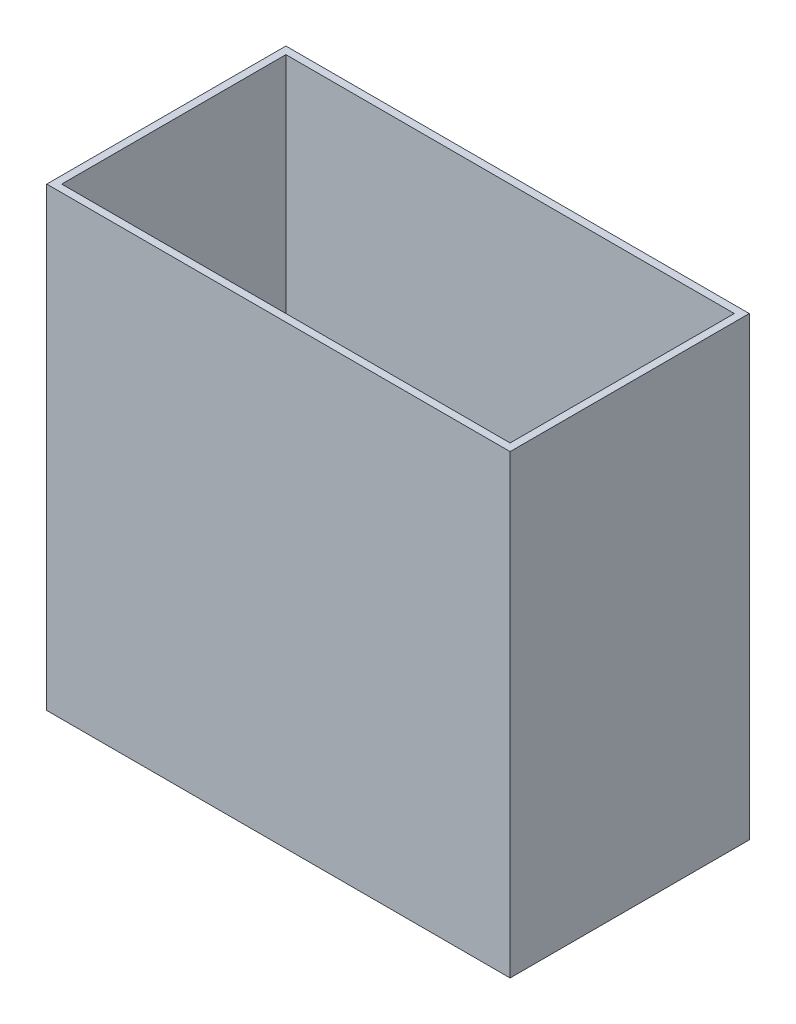
ISO-10303-21;
HEADER;
FILE_DESCRIPTION(('STEP AP214'),'2;1');
FILE_NAME('part.step','',(''),(''),'','','');
FILE_SCHEMA(('AUTOMOTIVE_DESIGN { 1 0 10303 214 1 1 1 1 }'));
ENDSEC;
DATA;
#1=APPLICATION_CONTEXT('core data for automotive mechanical design processes');
#2=APPLICATION_PROTOCOL_DEFINITION('international standard','automotive_design',2000,#1);
#3=PRODUCT_CONTEXT('',#1,'mechanical');
#4=PRODUCT('Part','Part','',(#3));
#5=PRODUCT_RELATED_PRODUCT_CATEGORY('part','',(#4));
#6=PRODUCT_DEFINITION_FORMATION('','',#4);
#7=PRODUCT_DEFINITION_CONTEXT('part definition',#1,'design');
#8=PRODUCT_DEFINITION('design','',#6,#7);
#9=PRODUCT_DEFINITION_SHAPE('','',#8);
#10=(LENGTH_UNIT() NAMED_UNIT(*) SI_UNIT(.MILLI.,.METRE.));
#11=(NAMED_UNIT(*) PLANE_ANGLE_UNIT() SI_UNIT($,.RADIAN.));
#12=(NAMED_UNIT(*) SI_UNIT($,.STERADIAN.) SOLID_ANGLE_UNIT());
#13=UNCERTAINTY_MEASURE_WITH_UNIT(LENGTH_MEASURE(1.E-05),#10,'distance_accuracy_value','');
#14=(GEOMETRIC_REPRESENTATION_CONTEXT(3) GLOBAL_UNCERTAINTY_ASSIGNED_CONTEXT((#13)) GLOBAL_UNIT_ASSIGNED_CONTEXT((#10,
#11,#12)) REPRESENTATION_CONTEXT('',''));
#15=CARTESIAN_POINT('',(0.,0.,0.));
#16=DIRECTION('',(0.,0.,1.));
#17=DIRECTION('',(1.,0.,0.));
#18=AXIS2_PLACEMENT_3D('',#15,#16,#17);
#19=CARTESIAN_POINT('',(30.,30.,30.));
#20=DIRECTION('',(0.,-1.,0.));
#21=DIRECTION('',(1.,0.,0.));
#22=AXIS2_PLACEMENT_3D('',#19,#20,#21);
#23=PLANE('',#22);
#24=DIRECTION('',(-1.,0.,0.));
#25=VECTOR('',#24,1.);
#26=CARTESIAN_POINT('',(0.,30.,-1.));
#27=LINE('',#26,#25);
#28=CARTESIAN_POINT('',(31.,30.,-1.));
#29=VERTEX_POINT('',#28);
#30=CARTESIAN_POINT('',(-31.,30.,-1.));
#31=VERTEX_POINT('',#30);
#32=EDGE_CURVE('E37',#29,#31,#27,.T.);
#33=ORIENTED_EDGE('',*,*,#32,.T.);
#34=DIRECTION('',(0.,0.,-1.));
#35=VECTOR('',#34,1.);
#36=CARTESIAN_POINT('',(-31.,30.,30.));
#37=LINE('',#36,#35);
#38=CARTESIAN_POINT('',(-31.,30.,31.));
#39=VERTEX_POINT('',#38);
#40=EDGE_CURVE('E150',#39,#31,#37,.T.);
#41=ORIENTED_EDGE('',*,*,#40,.F.);
#42=DIRECTION('',(-1.,0.,0.));
#43=VECTOR('',#42,1.);
#44=CARTESIAN_POINT('',(0.,30.,31.));
#45=LINE('',#44,#43);
#46=CARTESIAN_POINT('',(31.,30.,31.));
#47=VERTEX_POINT('',#46);
#48=EDGE_CURVE('E59',#47,#39,#45,.T.);
#49=ORIENTED_EDGE('',*,*,#48,.F.);
#50=DIRECTION('',(0.,0.,-1.));
#51=VECTOR('',#50,1.);
#52=CARTESIAN_POINT('',(31.,30.,30.));
#53=LINE('',#52,#51);
#54=EDGE_CURVE('E145',#47,#29,#53,.T.);
#55=ORIENTED_EDGE('',*,*,#54,.T.);
#56=EDGE_LOOP('',(#33,#41,#49,#55));
#57=FACE_BOUND('',#56,.T.);
#58=DIRECTION('',(-1.,0.,0.));
#59=VECTOR('',#58,1.);
#60=CARTESIAN_POINT('',(30.,30.,0.));
#61=LINE('',#60,#59);
#62=CARTESIAN_POINT('',(30.,30.,0.));
#63=VERTEX_POINT('',#62);
#64=CARTESIAN_POINT('',(-30.,30.,0.));
#65=VERTEX_POINT('',#64);
#66=EDGE_CURVE('E125',#63,#65,#61,.T.);
#67=ORIENTED_EDGE('',*,*,#66,.F.);
#68=DIRECTION('',(0.,0.,-1.));
#69=VECTOR('',#68,1.);
#70=CARTESIAN_POINT('',(30.,30.,30.));
#71=LINE('',#70,#69);
#72=CARTESIAN_POINT('',(30.,30.,30.));
#73=VERTEX_POINT('',#72);
#74=EDGE_CURVE('E135',#73,#63,#71,.T.);
#75=ORIENTED_EDGE('',*,*,#74,.F.);
#76=DIRECTION('',(-1.,0.,0.));
#77=VECTOR('',#76,1.);
#78=CARTESIAN_POINT('',(30.,30.,30.));
#79=LINE('',#78,#77);
#80=CARTESIAN_POINT('',(-30.,30.,30.));
#81=VERTEX_POINT('',#80);
#82=EDGE_CURVE('E50',#73,#81,#79,.T.);
#83=ORIENTED_EDGE('',*,*,#82,.T.);
#84=DIRECTION('',(0.,0.,-1.));
#85=VECTOR('',#84,1.);
#86=CARTESIAN_POINT('',(-30.,30.,30.));
#87=LINE('',#86,#85);
#88=EDGE_CURVE('E124',#81,#65,#87,.T.);
#89=ORIENTED_EDGE('',*,*,#88,.T.);
#90=EDGE_LOOP('',(#67,#75,#83,#89));
#91=FACE_BOUND('',#90,.T.);
#92=ADVANCED_FACE('F33',(#57,#91),#23,.F.);
#93=CARTESIAN_POINT('',(-31.,30.,30.));
#94=DIRECTION('',(1.,0.,0.));
#95=DIRECTION('',(0.,1.,0.));
#96=AXIS2_PLACEMENT_3D('',#93,#94,#95);
#97=PLANE('',#96);
#98=DIRECTION('',(0.,-1.,0.));
#99=VECTOR('',#98,1.);
#100=CARTESIAN_POINT('',(-31.,0.,-1.));
#101=LINE('',#100,#99);
#102=CARTESIAN_POINT('',(-31.,-31.,-1.));
#103=VERTEX_POINT('',#102);
#104=EDGE_CURVE('E129',#31,#103,#101,.T.);
#105=ORIENTED_EDGE('',*,*,#104,.T.);
#106=DIRECTION('',(0.,0.,-1.));
#107=VECTOR('',#106,1.);
#108=CARTESIAN_POINT('',(-31.,-31.,30.));
#109=LINE('',#108,#107);
#110=CARTESIAN_POINT('',(-31.,-31.,31.));
#111=VERTEX_POINT('',#110);
#112=EDGE_CURVE('E11',#111,#103,#109,.T.);
#113=ORIENTED_EDGE('',*,*,#112,.F.);
#114=DIRECTION('',(0.,-1.,0.));
#115=VECTOR('',#114,1.);
#116=CARTESIAN_POINT('',(-31.,0.,31.));
#117=LINE('',#116,#115);
#118=EDGE_CURVE('E139',#39,#111,#117,.T.);
#119=ORIENTED_EDGE('',*,*,#118,.F.);
#120=ORIENTED_EDGE('',*,*,#40,.T.);
#121=EDGE_LOOP('',(#105,#113,#119,#120));
#122=FACE_BOUND('',#121,.T.);
#123=ADVANCED_FACE('F161',(#122),#97,.F.);
#124=CARTESIAN_POINT('',(30.,-31.,30.));
#125=DIRECTION('',(0.,1.,0.));
#126=DIRECTION('',(-1.,0.,0.));
#127=AXIS2_PLACEMENT_3D('',#124,#125,#126);
#128=PLANE('',#127);
#129=DIRECTION('',(1.,0.,0.));
#130=VECTOR('',#129,1.);
#131=CARTESIAN_POINT('',(0.,-31.,-1.));
#132=LINE('',#131,#130);
#133=CARTESIAN_POINT('',(31.,-31.,-1.));
#134=VERTEX_POINT('',#133);
#135=EDGE_CURVE('E133',#103,#134,#132,.T.);
#136=ORIENTED_EDGE('',*,*,#135,.T.);
#137=DIRECTION('',(0.,0.,-1.));
#138=VECTOR('',#137,1.);
#139=CARTESIAN_POINT('',(31.,-31.,30.));
#140=LINE('',#139,#138);
#141=CARTESIAN_POINT('',(31.,-31.,31.));
#142=VERTEX_POINT('',#141);
#143=EDGE_CURVE('E42',#142,#134,#140,.T.);
#144=ORIENTED_EDGE('',*,*,#143,.F.);
#145=DIRECTION('',(1.,0.,0.));
#146=VECTOR('',#145,1.);
#147=CARTESIAN_POINT('',(0.,-31.,31.));
#148=LINE('',#147,#146);
#149=EDGE_CURVE('E80',#111,#142,#148,.T.);
#150=ORIENTED_EDGE('',*,*,#149,.F.);
#151=ORIENTED_EDGE('',*,*,#112,.T.);
#152=EDGE_LOOP('',(#136,#144,#150,#151));
#153=FACE_BOUND('',#152,.T.);
#154=ADVANCED_FACE('F164',(#153),#128,.F.);
#155=CARTESIAN_POINT('',(31.,30.,30.));
#156=DIRECTION('',(-1.,0.,0.));
#157=DIRECTION('',(0.,-1.,0.));
#158=AXIS2_PLACEMENT_3D('',#155,#156,#157);
#159=PLANE('',#158);
#160=DIRECTION('',(0.,1.,0.));
#161=VECTOR('',#160,1.);
#162=CARTESIAN_POINT('',(31.,0.,-1.));
#163=LINE('',#162,#161);
#164=EDGE_CURVE('E142',#134,#29,#163,.T.);
#165=ORIENTED_EDGE('',*,*,#164,.T.);
#166=ORIENTED_EDGE('',*,*,#54,.F.);
#167=DIRECTION('',(0.,1.,0.));
#168=VECTOR('',#167,1.);
#169=CARTESIAN_POINT('',(31.,0.,31.));
#170=LINE('',#169,#168);
#171=EDGE_CURVE('E147',#142,#47,#170,.T.);
#172=ORIENTED_EDGE('',*,*,#171,.F.);
#173=ORIENTED_EDGE('',*,*,#143,.T.);
#174=EDGE_LOOP('',(#165,#166,#172,#173));
#175=FACE_BOUND('',#174,.T.);
#176=ADVANCED_FACE('F165',(#175),#159,.F.);
#177=CARTESIAN_POINT('',(0.,0.,31.));
#178=DIRECTION('',(0.,0.,-1.));
#179=DIRECTION('',(-1.,0.,0.));
#180=AXIS2_PLACEMENT_3D('',#177,#178,#179);
#181=PLANE('',#180);
#182=ORIENTED_EDGE('',*,*,#118,.T.);
#183=ORIENTED_EDGE('',*,*,#149,.T.);
#184=ORIENTED_EDGE('',*,*,#171,.T.);
#185=ORIENTED_EDGE('',*,*,#48,.T.);
#186=EDGE_LOOP('',(#182,#183,#184,#185));
#187=FACE_BOUND('',#186,.T.);
#188=ADVANCED_FACE('F163',(#187),#181,.F.);
#189=CARTESIAN_POINT('',(0.,0.,-1.));
#190=DIRECTION('',(0.,0.,-1.));
#191=DIRECTION('',(-1.,0.,0.));
#192=AXIS2_PLACEMENT_3D('',#189,#190,#191);
#193=PLANE('',#192);
#194=ORIENTED_EDGE('',*,*,#104,.F.);
#195=ORIENTED_EDGE('',*,*,#32,.F.);
#196=ORIENTED_EDGE('',*,*,#164,.F.);
#197=ORIENTED_EDGE('',*,*,#135,.F.);
#198=EDGE_LOOP('',(#194,#195,#196,#197));
#199=FACE_BOUND('',#198,.T.);
#200=ADVANCED_FACE('F35',(#199),#193,.T.);
#201=CARTESIAN_POINT('',(-30.,30.,30.));
#202=DIRECTION('',(1.,0.,0.));
#203=DIRECTION('',(0.,1.,0.));
#204=AXIS2_PLACEMENT_3D('',#201,#202,#203);
#205=PLANE('',#204);
#206=DIRECTION('',(0.,-1.,0.));
#207=VECTOR('',#206,1.);
#208=CARTESIAN_POINT('',(-30.,30.,0.));
#209=LINE('',#208,#207);
#210=CARTESIAN_POINT('',(-30.,-30.,0.));
#211=VERTEX_POINT('',#210);
#212=EDGE_CURVE('E256',#65,#211,#209,.T.);
#213=ORIENTED_EDGE('',*,*,#212,.F.);
#214=ORIENTED_EDGE('',*,*,#88,.F.);
#215=DIRECTION('',(0.,-1.,0.));
#216=VECTOR('',#215,1.);
#217=CARTESIAN_POINT('',(-30.,30.,30.));
#218=LINE('',#217,#216);
#219=CARTESIAN_POINT('',(-30.,-30.,30.));
#220=VERTEX_POINT('',#219);
#221=EDGE_CURVE('E110',#81,#220,#218,.T.);
#222=ORIENTED_EDGE('',*,*,#221,.T.);
#223=DIRECTION('',(0.,0.,-1.));
#224=VECTOR('',#223,1.);
#225=CARTESIAN_POINT('',(-30.,-30.,30.));
#226=LINE('',#225,#224);
#227=EDGE_CURVE('E121',#220,#211,#226,.T.);
#228=ORIENTED_EDGE('',*,*,#227,.T.);
#229=EDGE_LOOP('',(#213,#214,#222,#228));
#230=FACE_BOUND('',#229,.T.);
#231=ADVANCED_FACE('F120',(#230),#205,.T.);
#232=CARTESIAN_POINT('',(30.,-30.,30.));
#233=DIRECTION('',(0.,1.,0.));
#234=DIRECTION('',(-1.,0.,0.));
#235=AXIS2_PLACEMENT_3D('',#232,#233,#234);
#236=PLANE('',#235);
#237=DIRECTION('',(1.,0.,0.));
#238=VECTOR('',#237,1.);
#239=CARTESIAN_POINT('',(30.,-30.,0.));
#240=LINE('',#239,#238);
#241=CARTESIAN_POINT('',(30.,-30.,0.));
#242=VERTEX_POINT('',#241);
#243=EDGE_CURVE('E128',#211,#242,#240,.T.);
#244=ORIENTED_EDGE('',*,*,#243,.F.);
#245=ORIENTED_EDGE('',*,*,#227,.F.);
#246=DIRECTION('',(1.,0.,0.));
#247=VECTOR('',#246,1.);
#248=CARTESIAN_POINT('',(30.,-30.,30.));
#249=LINE('',#248,#247);
#250=CARTESIAN_POINT('',(30.,-30.,30.));
#251=VERTEX_POINT('',#250);
#252=EDGE_CURVE('E107',#220,#251,#249,.T.);
#253=ORIENTED_EDGE('',*,*,#252,.T.);
#254=DIRECTION('',(0.,0.,-1.));
#255=VECTOR('',#254,1.);
#256=CARTESIAN_POINT('',(30.,-30.,30.));
#257=LINE('',#256,#255);
#258=EDGE_CURVE('E130',#251,#242,#257,.T.);
#259=ORIENTED_EDGE('',*,*,#258,.T.);
#260=EDGE_LOOP('',(#244,#245,#253,#259));
#261=FACE_BOUND('',#260,.T.);
#262=ADVANCED_FACE('F127',(#261),#236,.T.);
#263=CARTESIAN_POINT('',(30.,30.,30.));
#264=DIRECTION('',(-1.,0.,0.));
#265=DIRECTION('',(0.,-1.,0.));
#266=AXIS2_PLACEMENT_3D('',#263,#264,#265);
#267=PLANE('',#266);
#268=DIRECTION('',(0.,1.,0.));
#269=VECTOR('',#268,1.);
#270=CARTESIAN_POINT('',(30.,30.,0.));
#271=LINE('',#270,#269);
#272=EDGE_CURVE('E259',#242,#63,#271,.T.);
#273=ORIENTED_EDGE('',*,*,#272,.F.);
#274=ORIENTED_EDGE('',*,*,#258,.F.);
#275=DIRECTION('',(0.,1.,0.));
#276=VECTOR('',#275,1.);
#277=CARTESIAN_POINT('',(30.,30.,30.));
#278=LINE('',#277,#276);
#279=EDGE_CURVE('E111',#251,#73,#278,.T.);
#280=ORIENTED_EDGE('',*,*,#279,.T.);
#281=ORIENTED_EDGE('',*,*,#74,.T.);
#282=EDGE_LOOP('',(#273,#274,#280,#281));
#283=FACE_BOUND('',#282,.T.);
#284=ADVANCED_FACE('F184',(#283),#267,.T.);
#285=CARTESIAN_POINT('',(0.,0.,30.));
#286=DIRECTION('',(0.,0.,-1.));
#287=DIRECTION('',(-1.,0.,0.));
#288=AXIS2_PLACEMENT_3D('',#285,#286,#287);
#289=PLANE('',#288);
#290=ORIENTED_EDGE('',*,*,#221,.F.);
#291=ORIENTED_EDGE('',*,*,#82,.F.);
#292=ORIENTED_EDGE('',*,*,#279,.F.);
#293=ORIENTED_EDGE('',*,*,#252,.F.);
#294=EDGE_LOOP('',(#290,#291,#292,#293));
#295=FACE_BOUND('',#294,.T.);
#296=ADVANCED_FACE('F109',(#295),#289,.T.);
#297=CARTESIAN_POINT('',(0.,0.,0.));
#298=DIRECTION('',(0.,0.,-1.));
#299=DIRECTION('',(-1.,0.,0.));
#300=AXIS2_PLACEMENT_3D('',#297,#298,#299);
#301=PLANE('',#300);
#302=ORIENTED_EDGE('',*,*,#212,.T.);
#303=ORIENTED_EDGE('',*,*,#243,.T.);
#304=ORIENTED_EDGE('',*,*,#272,.T.);
#305=ORIENTED_EDGE('',*,*,#66,.T.);
#306=EDGE_LOOP('',(#302,#303,#304,#305));
#307=FACE_BOUND('',#306,.T.);
#308=ADVANCED_FACE('F188',(#307),#301,.F.);
#309=CLOSED_SHELL('',(#92,#123,#154,#176,#188,#200,#231,#262,#284,#296,#308));
#310=MANIFOLD_SOLID_BREP('B2',#309);
#311=ADVANCED_BREP_SHAPE_REPRESENTATION('',(#18,#310),#14);
#312=SHAPE_DEFINITION_REPRESENTATION(#9,#311);
ENDSEC;
END-ISO-10303-21;
